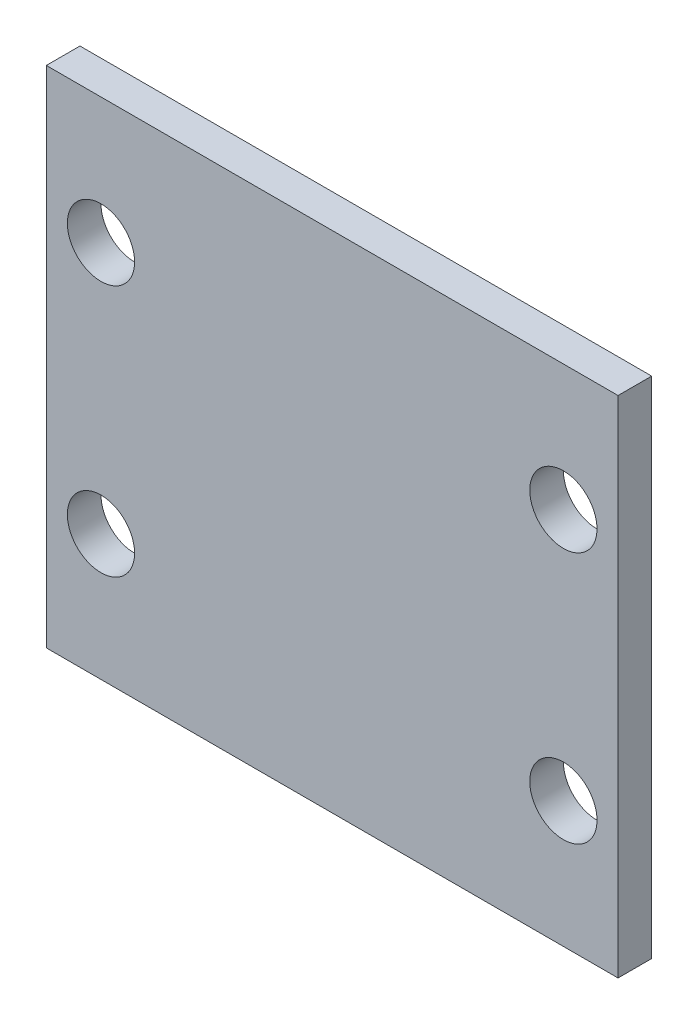
ISO-10303-21;
HEADER;
FILE_DESCRIPTION(('STEP AP214'),'2;1');
FILE_NAME('part.step','',(''),(''),'','','');
FILE_SCHEMA(('AUTOMOTIVE_DESIGN { 1 0 10303 214 1 1 1 1 }'));
ENDSEC;
DATA;
#1=APPLICATION_CONTEXT('core data for automotive mechanical design processes');
#2=APPLICATION_PROTOCOL_DEFINITION('international standard','automotive_design',2000,#1);
#3=PRODUCT_CONTEXT('',#1,'mechanical');
#4=PRODUCT('Part','Part','',(#3));
#5=PRODUCT_RELATED_PRODUCT_CATEGORY('part','',(#4));
#6=PRODUCT_DEFINITION_FORMATION('','',#4);
#7=PRODUCT_DEFINITION_CONTEXT('part definition',#1,'design');
#8=PRODUCT_DEFINITION('design','',#6,#7);
#9=PRODUCT_DEFINITION_SHAPE('','',#8);
#10=(LENGTH_UNIT() NAMED_UNIT(*) SI_UNIT(.MILLI.,.METRE.));
#11=(NAMED_UNIT(*) PLANE_ANGLE_UNIT() SI_UNIT($,.RADIAN.));
#12=(NAMED_UNIT(*) SI_UNIT($,.STERADIAN.) SOLID_ANGLE_UNIT());
#13=UNCERTAINTY_MEASURE_WITH_UNIT(LENGTH_MEASURE(1.E-05),#10,'distance_accuracy_value','');
#14=(GEOMETRIC_REPRESENTATION_CONTEXT(3) GLOBAL_UNCERTAINTY_ASSIGNED_CONTEXT((#13)) GLOBAL_UNIT_ASSIGNED_CONTEXT((#10,
#11,#12)) REPRESENTATION_CONTEXT('',''));
#15=CARTESIAN_POINT('',(0.,0.,0.));
#16=DIRECTION('',(0.,0.,1.));
#17=DIRECTION('',(1.,0.,0.));
#18=AXIS2_PLACEMENT_3D('',#15,#16,#17);
#19=CARTESIAN_POINT('',(0.,0.,2.54));
#20=DIRECTION('',(0.,0.,1.));
#21=DIRECTION('',(1.,0.,0.));
#22=AXIS2_PLACEMENT_3D('',#19,#20,#21);
#23=PLANE('',#22);
#24=CARTESIAN_POINT('',(17.46254572,-9.52546482,2.54));
#25=DIRECTION('',(0.,0.,1.));
#26=DIRECTION('',(-1.,0.,0.));
#27=AXIS2_PLACEMENT_3D('',#24,#25,#26);
#28=CIRCLE('',#27,2.53999492);
#29=CARTESIAN_POINT('',(14.9225508,-9.52546482,2.54));
#30=VERTEX_POINT('',#29);
#31=EDGE_CURVE('E125',#30,#30,#28,.T.);
#32=ORIENTED_EDGE('',*,*,#31,.F.);
#33=EDGE_LOOP('',(#32));
#34=FACE_BOUND('',#33,.T.);
#35=CARTESIAN_POINT('',(-17.46254572,9.52481966,2.54));
#36=DIRECTION('',(0.,0.,1.));
#37=DIRECTION('',(1.,0.,0.));
#38=AXIS2_PLACEMENT_3D('',#35,#36,#37);
#39=CIRCLE('',#38,2.54);
#40=CARTESIAN_POINT('',(-14.92254572,9.52481966,2.54));
#41=VERTEX_POINT('',#40);
#42=EDGE_CURVE('E104',#41,#41,#39,.T.);
#43=ORIENTED_EDGE('',*,*,#42,.F.);
#44=EDGE_LOOP('',(#43));
#45=FACE_BOUND('',#44,.T.);
#46=DIRECTION('',(0.,1.,0.));
#47=VECTOR('',#46,1.);
#48=CARTESIAN_POINT('',(21.58995682,19.0499619,2.54));
#49=LINE('',#48,#47);
#50=CARTESIAN_POINT('',(21.58995682,-19.0499619,2.54));
#51=VERTEX_POINT('',#50);
#52=CARTESIAN_POINT('',(21.58995682,19.0499619,2.54));
#53=VERTEX_POINT('',#52);
#54=EDGE_CURVE('E89',#51,#53,#49,.T.);
#55=ORIENTED_EDGE('',*,*,#54,.T.);
#56=DIRECTION('',(-1.,0.,0.));
#57=VECTOR('',#56,1.);
#58=CARTESIAN_POINT('',(-21.58995682,19.0499619,2.54));
#59=LINE('',#58,#57);
#60=CARTESIAN_POINT('',(-21.58995682,19.0499619,2.54));
#61=VERTEX_POINT('',#60);
#62=EDGE_CURVE('E84',#53,#61,#59,.T.);
#63=ORIENTED_EDGE('',*,*,#62,.T.);
#64=DIRECTION('',(0.,-1.,0.));
#65=VECTOR('',#64,1.);
#66=CARTESIAN_POINT('',(-21.58995682,19.0499619,2.54));
#67=LINE('',#66,#65);
#68=CARTESIAN_POINT('',(-21.58995682,-19.0499619,2.54));
#69=VERTEX_POINT('',#68);
#70=EDGE_CURVE('E87',#61,#69,#67,.T.);
#71=ORIENTED_EDGE('',*,*,#70,.T.);
#72=DIRECTION('',(1.,0.,0.));
#73=VECTOR('',#72,1.);
#74=CARTESIAN_POINT('',(-21.58995682,-19.0499619,2.54));
#75=LINE('',#74,#73);
#76=EDGE_CURVE('E54',#69,#51,#75,.T.);
#77=ORIENTED_EDGE('',*,*,#76,.T.);
#78=EDGE_LOOP('',(#55,#63,#71,#77));
#79=FACE_BOUND('',#78,.T.);
#80=CARTESIAN_POINT('',(-17.46254572,-9.52546482,2.54));
#81=DIRECTION('',(0.,0.,1.));
#82=DIRECTION('',(1.,0.,0.));
#83=AXIS2_PLACEMENT_3D('',#80,#81,#82);
#84=CIRCLE('',#83,2.53999492);
#85=CARTESIAN_POINT('',(-14.9225508,-9.52546482,2.54));
#86=VERTEX_POINT('',#85);
#87=EDGE_CURVE('E119',#86,#86,#84,.T.);
#88=ORIENTED_EDGE('',*,*,#87,.F.);
#89=EDGE_LOOP('',(#88));
#90=FACE_BOUND('',#89,.T.);
#91=CARTESIAN_POINT('',(17.46254572,9.52481966,2.54));
#92=DIRECTION('',(0.,0.,1.));
#93=DIRECTION('',(-1.,0.,0.));
#94=AXIS2_PLACEMENT_3D('',#91,#92,#93);
#95=CIRCLE('',#94,2.54);
#96=CARTESIAN_POINT('',(14.92254572,9.52481966,2.54));
#97=VERTEX_POINT('',#96);
#98=EDGE_CURVE('E131',#97,#97,#95,.T.);
#99=ORIENTED_EDGE('',*,*,#98,.F.);
#100=EDGE_LOOP('',(#99));
#101=FACE_BOUND('',#100,.T.);
#102=ADVANCED_FACE('F37',(#34,#45,#79,#90,#101),#23,.T.);
#103=CARTESIAN_POINT('',(0.,0.,0.));
#104=DIRECTION('',(0.,0.,1.));
#105=DIRECTION('',(1.,0.,0.));
#106=AXIS2_PLACEMENT_3D('',#103,#104,#105);
#107=PLANE('',#106);
#108=DIRECTION('',(0.,1.,0.));
#109=VECTOR('',#108,1.);
#110=CARTESIAN_POINT('',(21.58995682,19.0499619,0.));
#111=LINE('',#110,#109);
#112=CARTESIAN_POINT('',(21.58995682,-19.0499619,0.));
#113=VERTEX_POINT('',#112);
#114=CARTESIAN_POINT('',(21.58995682,19.0499619,0.));
#115=VERTEX_POINT('',#114);
#116=EDGE_CURVE('E101',#113,#115,#111,.T.);
#117=ORIENTED_EDGE('',*,*,#116,.F.);
#118=DIRECTION('',(1.,0.,0.));
#119=VECTOR('',#118,1.);
#120=CARTESIAN_POINT('',(-21.58995682,-19.0499619,0.));
#121=LINE('',#120,#119);
#122=CARTESIAN_POINT('',(-21.58995682,-19.0499619,0.));
#123=VERTEX_POINT('',#122);
#124=EDGE_CURVE('E77',#123,#113,#121,.T.);
#125=ORIENTED_EDGE('',*,*,#124,.F.);
#126=DIRECTION('',(0.,-1.,0.));
#127=VECTOR('',#126,1.);
#128=CARTESIAN_POINT('',(-21.58995682,19.0499619,0.));
#129=LINE('',#128,#127);
#130=CARTESIAN_POINT('',(-21.58995682,19.0499619,0.));
#131=VERTEX_POINT('',#130);
#132=EDGE_CURVE('E71',#131,#123,#129,.T.);
#133=ORIENTED_EDGE('',*,*,#132,.F.);
#134=DIRECTION('',(-1.,0.,0.));
#135=VECTOR('',#134,1.);
#136=CARTESIAN_POINT('',(-21.58995682,19.0499619,0.));
#137=LINE('',#136,#135);
#138=EDGE_CURVE('E93',#115,#131,#137,.T.);
#139=ORIENTED_EDGE('',*,*,#138,.F.);
#140=EDGE_LOOP('',(#117,#125,#133,#139));
#141=FACE_BOUND('',#140,.T.);
#142=CARTESIAN_POINT('',(-17.46254572,9.52481966,0.));
#143=DIRECTION('',(0.,0.,1.));
#144=DIRECTION('',(1.,0.,0.));
#145=AXIS2_PLACEMENT_3D('',#142,#143,#144);
#146=CIRCLE('',#145,2.54);
#147=CARTESIAN_POINT('',(-14.92254572,9.52481966,0.));
#148=VERTEX_POINT('',#147);
#149=EDGE_CURVE('E116',#148,#148,#146,.T.);
#150=ORIENTED_EDGE('',*,*,#149,.T.);
#151=EDGE_LOOP('',(#150));
#152=FACE_BOUND('',#151,.T.);
#153=CARTESIAN_POINT('',(-17.46254572,-9.52546482,0.));
#154=DIRECTION('',(0.,0.,1.));
#155=DIRECTION('',(1.,0.,0.));
#156=AXIS2_PLACEMENT_3D('',#153,#154,#155);
#157=CIRCLE('',#156,2.53999492);
#158=CARTESIAN_POINT('',(-14.9225508,-9.52546482,0.));
#159=VERTEX_POINT('',#158);
#160=EDGE_CURVE('E122',#159,#159,#157,.T.);
#161=ORIENTED_EDGE('',*,*,#160,.T.);
#162=EDGE_LOOP('',(#161));
#163=FACE_BOUND('',#162,.T.);
#164=CARTESIAN_POINT('',(17.46254572,-9.52546482,0.));
#165=DIRECTION('',(0.,0.,1.));
#166=DIRECTION('',(-1.,0.,0.));
#167=AXIS2_PLACEMENT_3D('',#164,#165,#166);
#168=CIRCLE('',#167,2.53999492);
#169=CARTESIAN_POINT('',(14.9225508,-9.52546482,0.));
#170=VERTEX_POINT('',#169);
#171=EDGE_CURVE('E128',#170,#170,#168,.T.);
#172=ORIENTED_EDGE('',*,*,#171,.T.);
#173=EDGE_LOOP('',(#172));
#174=FACE_BOUND('',#173,.T.);
#175=CARTESIAN_POINT('',(17.46254572,9.52481966,0.));
#176=DIRECTION('',(0.,0.,1.));
#177=DIRECTION('',(-1.,0.,0.));
#178=AXIS2_PLACEMENT_3D('',#175,#176,#177);
#179=CIRCLE('',#178,2.54);
#180=CARTESIAN_POINT('',(14.92254572,9.52481966,0.));
#181=VERTEX_POINT('',#180);
#182=EDGE_CURVE('E134',#181,#181,#179,.T.);
#183=ORIENTED_EDGE('',*,*,#182,.T.);
#184=EDGE_LOOP('',(#183));
#185=FACE_BOUND('',#184,.T.);
#186=ADVANCED_FACE('F112',(#141,#152,#163,#174,#185),#107,.F.);
#187=CARTESIAN_POINT('',(21.58995682,19.0499619,2.54));
#188=DIRECTION('',(-1.,0.,0.));
#189=DIRECTION('',(0.,-1.,0.));
#190=AXIS2_PLACEMENT_3D('',#187,#188,#189);
#191=PLANE('',#190);
#192=ORIENTED_EDGE('',*,*,#116,.T.);
#193=DIRECTION('',(0.,0.,-1.));
#194=VECTOR('',#193,1.);
#195=CARTESIAN_POINT('',(21.58995682,19.0499619,2.54));
#196=LINE('',#195,#194);
#197=EDGE_CURVE('E11',#53,#115,#196,.T.);
#198=ORIENTED_EDGE('',*,*,#197,.F.);
#199=ORIENTED_EDGE('',*,*,#54,.F.);
#200=DIRECTION('',(0.,0.,-1.));
#201=VECTOR('',#200,1.);
#202=CARTESIAN_POINT('',(21.58995682,-19.0499619,2.54));
#203=LINE('',#202,#201);
#204=EDGE_CURVE('E97',#51,#113,#203,.T.);
#205=ORIENTED_EDGE('',*,*,#204,.T.);
#206=EDGE_LOOP('',(#192,#198,#199,#205));
#207=FACE_BOUND('',#206,.T.);
#208=ADVANCED_FACE('F39',(#207),#191,.F.);
#209=CARTESIAN_POINT('',(-21.58995682,19.0499619,2.54));
#210=DIRECTION('',(0.,-1.,0.));
#211=DIRECTION('',(1.,0.,0.));
#212=AXIS2_PLACEMENT_3D('',#209,#210,#211);
#213=PLANE('',#212);
#214=ORIENTED_EDGE('',*,*,#138,.T.);
#215=DIRECTION('',(0.,0.,-1.));
#216=VECTOR('',#215,1.);
#217=CARTESIAN_POINT('',(-21.58995682,19.0499619,2.54));
#218=LINE('',#217,#216);
#219=EDGE_CURVE('E46',#61,#131,#218,.T.);
#220=ORIENTED_EDGE('',*,*,#219,.F.);
#221=ORIENTED_EDGE('',*,*,#62,.F.);
#222=ORIENTED_EDGE('',*,*,#197,.T.);
#223=EDGE_LOOP('',(#214,#220,#221,#222));
#224=FACE_BOUND('',#223,.T.);
#225=ADVANCED_FACE('F92',(#224),#213,.F.);
#226=CARTESIAN_POINT('',(-21.58995682,19.0499619,2.54));
#227=DIRECTION('',(1.,0.,0.));
#228=DIRECTION('',(0.,0.,-1.));
#229=AXIS2_PLACEMENT_3D('',#226,#227,#228);
#230=PLANE('',#229);
#231=ORIENTED_EDGE('',*,*,#132,.T.);
#232=DIRECTION('',(0.,0.,-1.));
#233=VECTOR('',#232,1.);
#234=CARTESIAN_POINT('',(-21.58995682,-19.0499619,2.54));
#235=LINE('',#234,#233);
#236=EDGE_CURVE('E94',#69,#123,#235,.T.);
#237=ORIENTED_EDGE('',*,*,#236,.F.);
#238=ORIENTED_EDGE('',*,*,#70,.F.);
#239=ORIENTED_EDGE('',*,*,#219,.T.);
#240=EDGE_LOOP('',(#231,#237,#238,#239));
#241=FACE_BOUND('',#240,.T.);
#242=ADVANCED_FACE('F95',(#241),#230,.F.);
#243=CARTESIAN_POINT('',(-21.58995682,-19.0499619,2.54));
#244=DIRECTION('',(0.,1.,0.));
#245=DIRECTION('',(-1.,0.,0.));
#246=AXIS2_PLACEMENT_3D('',#243,#244,#245);
#247=PLANE('',#246);
#248=ORIENTED_EDGE('',*,*,#124,.T.);
#249=ORIENTED_EDGE('',*,*,#204,.F.);
#250=ORIENTED_EDGE('',*,*,#76,.F.);
#251=ORIENTED_EDGE('',*,*,#236,.T.);
#252=EDGE_LOOP('',(#248,#249,#250,#251));
#253=FACE_BOUND('',#252,.T.);
#254=ADVANCED_FACE('F109',(#253),#247,.F.);
#255=CARTESIAN_POINT('',(-17.46254572,9.52481966,2.54));
#256=DIRECTION('',(0.,0.,-1.));
#257=DIRECTION('',(-1.,0.,0.));
#258=AXIS2_PLACEMENT_3D('',#255,#256,#257);
#259=CYLINDRICAL_SURFACE('',#258,2.54);
#260=ORIENTED_EDGE('',*,*,#42,.T.);
#261=EDGE_LOOP('',(#260));
#262=FACE_BOUND('',#261,.T.);
#263=ORIENTED_EDGE('',*,*,#149,.F.);
#264=EDGE_LOOP('',(#263));
#265=FACE_BOUND('',#264,.T.);
#266=ADVANCED_FACE('F153',(#262,#265),#259,.F.);
#267=CARTESIAN_POINT('',(-17.46254572,-9.52546482,2.54));
#268=DIRECTION('',(0.,0.,-1.));
#269=DIRECTION('',(-1.,0.,0.));
#270=AXIS2_PLACEMENT_3D('',#267,#268,#269);
#271=CYLINDRICAL_SURFACE('',#270,2.53999492);
#272=ORIENTED_EDGE('',*,*,#87,.T.);
#273=EDGE_LOOP('',(#272));
#274=FACE_BOUND('',#273,.T.);
#275=ORIENTED_EDGE('',*,*,#160,.F.);
#276=EDGE_LOOP('',(#275));
#277=FACE_BOUND('',#276,.T.);
#278=ADVANCED_FACE('F207',(#274,#277),#271,.F.);
#279=CARTESIAN_POINT('',(17.46254572,-9.52546482,2.54));
#280=DIRECTION('',(0.,0.,-1.));
#281=DIRECTION('',(-1.,0.,0.));
#282=AXIS2_PLACEMENT_3D('',#279,#280,#281);
#283=CYLINDRICAL_SURFACE('',#282,2.53999492);
#284=ORIENTED_EDGE('',*,*,#31,.T.);
#285=EDGE_LOOP('',(#284));
#286=FACE_BOUND('',#285,.T.);
#287=ORIENTED_EDGE('',*,*,#171,.F.);
#288=EDGE_LOOP('',(#287));
#289=FACE_BOUND('',#288,.T.);
#290=ADVANCED_FACE('F216',(#286,#289),#283,.F.);
#291=CARTESIAN_POINT('',(17.46254572,9.52481966,2.54));
#292=DIRECTION('',(0.,0.,-1.));
#293=DIRECTION('',(-1.,0.,0.));
#294=AXIS2_PLACEMENT_3D('',#291,#292,#293);
#295=CYLINDRICAL_SURFACE('',#294,2.54);
#296=ORIENTED_EDGE('',*,*,#98,.T.);
#297=EDGE_LOOP('',(#296));
#298=FACE_BOUND('',#297,.T.);
#299=ORIENTED_EDGE('',*,*,#182,.F.);
#300=EDGE_LOOP('',(#299));
#301=FACE_BOUND('',#300,.T.);
#302=ADVANCED_FACE('F140',(#298,#301),#295,.F.);
#303=CLOSED_SHELL('',(#102,#186,#208,#225,#242,#254,#266,#278,#290,#302));
#304=MANIFOLD_SOLID_BREP('B2',#303);
#305=ADVANCED_BREP_SHAPE_REPRESENTATION('',(#18,#304),#14);
#306=SHAPE_DEFINITION_REPRESENTATION(#9,#305);
ENDSEC;
END-ISO-10303-21;
